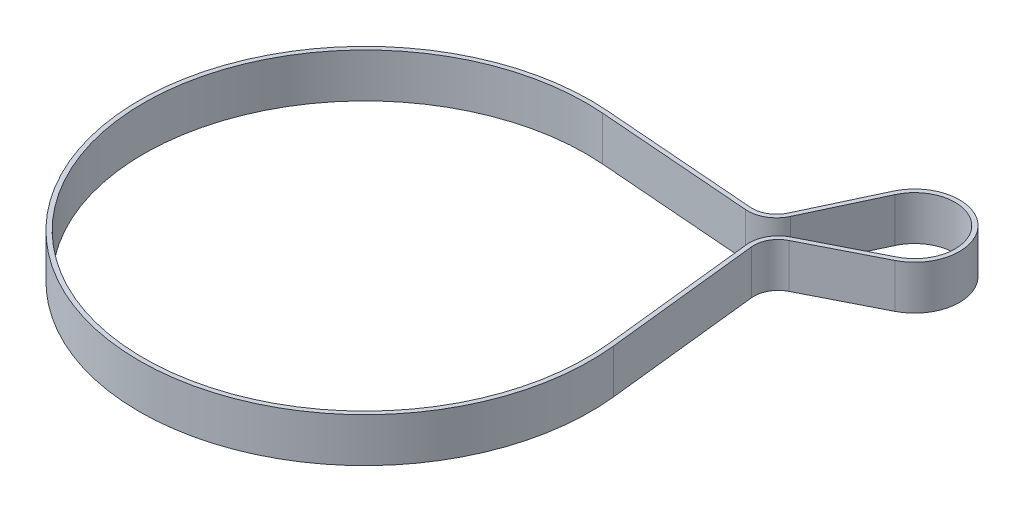
ISO-10303-21;
HEADER;
FILE_DESCRIPTION(('STEP AP214'),'2;1');
FILE_NAME('part.step','',(''),(''),'','','');
FILE_SCHEMA(('AUTOMOTIVE_DESIGN { 1 0 10303 214 1 1 1 1 }'));
ENDSEC;
DATA;
#1=APPLICATION_CONTEXT('core data for automotive mechanical design processes');
#2=APPLICATION_PROTOCOL_DEFINITION('international standard','automotive_design',2000,#1);
#3=PRODUCT_CONTEXT('',#1,'mechanical');
#4=PRODUCT('Part','Part','',(#3));
#5=PRODUCT_RELATED_PRODUCT_CATEGORY('part','',(#4));
#6=PRODUCT_DEFINITION_FORMATION('','',#4);
#7=PRODUCT_DEFINITION_CONTEXT('part definition',#1,'design');
#8=PRODUCT_DEFINITION('design','',#6,#7);
#9=PRODUCT_DEFINITION_SHAPE('','',#8);
#10=(LENGTH_UNIT() NAMED_UNIT(*) SI_UNIT(.MILLI.,.METRE.));
#11=(NAMED_UNIT(*) PLANE_ANGLE_UNIT() SI_UNIT($,.RADIAN.));
#12=(NAMED_UNIT(*) SI_UNIT($,.STERADIAN.) SOLID_ANGLE_UNIT());
#13=UNCERTAINTY_MEASURE_WITH_UNIT(LENGTH_MEASURE(1.E-05),#10,'distance_accuracy_value','');
#14=(GEOMETRIC_REPRESENTATION_CONTEXT(3) GLOBAL_UNCERTAINTY_ASSIGNED_CONTEXT((#13)) GLOBAL_UNIT_ASSIGNED_CONTEXT((#10,
#11,#12)) REPRESENTATION_CONTEXT('',''));
#15=CARTESIAN_POINT('',(0.,0.,0.));
#16=DIRECTION('',(0.,0.,1.));
#17=DIRECTION('',(1.,0.,0.));
#18=AXIS2_PLACEMENT_3D('',#15,#16,#17);
#19=CARTESIAN_POINT('',(6.0102406949203,10.,-56.1325687515136));
#20=DIRECTION('',(0.,-1.,0.));
#21=DIRECTION('',(0.,0.,-1.));
#22=AXIS2_PLACEMENT_3D('',#19,#20,#21);
#23=CYLINDRICAL_SURFACE('',#22,9.16999999999999);
#24=CARTESIAN_POINT('',(6.0102406949203,0.,-56.1325687515136));
#25=DIRECTION('',(0.,1.,0.));
#26=DIRECTION('',(0.,0.,1.));
#27=AXIS2_PLACEMENT_3D('',#24,#25,#26);
#28=CIRCLE('',#27,9.16999999999999);
#29=CARTESIAN_POINT('',(10.1580336639767,0.,-47.9542612563258));
#30=VERTEX_POINT('',#29);
#31=CARTESIAN_POINT('',(-2.29239001303139,0.,-60.0255397669949));
#32=VERTEX_POINT('',#31);
#33=EDGE_CURVE('E262',#30,#32,#28,.T.);
#34=ORIENTED_EDGE('',*,*,#33,.F.);
#35=DIRECTION('',(0.,-1.,0.));
#36=VECTOR('',#35,1.);
#37=CARTESIAN_POINT('',(10.1580336639767,10.,-47.9542612563258));
#38=LINE('',#37,#36);
#39=CARTESIAN_POINT('',(10.1580336639767,10.,-47.9542612563258));
#40=VERTEX_POINT('',#39);
#41=EDGE_CURVE('E11',#40,#30,#38,.T.);
#42=ORIENTED_EDGE('',*,*,#41,.F.);
#43=CARTESIAN_POINT('',(6.0102406949203,10.,-56.1325687515136));
#44=DIRECTION('',(0.,1.,0.));
#45=DIRECTION('',(0.,0.,1.));
#46=AXIS2_PLACEMENT_3D('',#43,#44,#45);
#47=CIRCLE('',#46,9.16999999999999);
#48=CARTESIAN_POINT('',(-2.29239001303139,10.,-60.0255397669949));
#49=VERTEX_POINT('',#48);
#50=EDGE_CURVE('E309',#40,#49,#47,.T.);
#51=ORIENTED_EDGE('',*,*,#50,.T.);
#52=DIRECTION('',(0.,-1.,0.));
#53=VECTOR('',#52,1.);
#54=CARTESIAN_POINT('',(-2.29239001303139,10.,-60.0255397669949));
#55=LINE('',#54,#53);
#56=EDGE_CURVE('E121',#49,#32,#55,.T.);
#57=ORIENTED_EDGE('',*,*,#56,.T.);
#58=EDGE_LOOP('',(#34,#42,#51,#57));
#59=FACE_BOUND('',#58,.T.);
#60=ADVANCED_FACE('F43',(#59),#23,.F.);
#61=CARTESIAN_POINT('',(-17.2667285651984,10.,-34.0452420589981));
#62=DIRECTION('',(-0.452322024978891,0.,-0.891854688679157));
#63=DIRECTION('',(-0.891854688679157,0.,0.452322024978891));
#64=AXIS2_PLACEMENT_3D('',#61,#62,#63);
#65=PLANE('',#64);
#66=DIRECTION('',(0.891854688679157,0.,-0.452322024978891));
#67=VECTOR('',#66,1.);
#68=CARTESIAN_POINT('',(-17.2667285651984,0.,-34.0452420589981));
#69=LINE('',#68,#67);
#70=CARTESIAN_POINT('',(-5.78225911072466,0.,-39.8698214948579));
#71=VERTEX_POINT('',#70);
#72=EDGE_CURVE('E258',#71,#30,#69,.T.);
#73=ORIENTED_EDGE('',*,*,#72,.F.);
#74=DIRECTION('',(0.,-1.,0.));
#75=VECTOR('',#74,1.);
#76=CARTESIAN_POINT('',(-5.78225911072466,10.,-39.8698214948579));
#77=LINE('',#76,#75);
#78=CARTESIAN_POINT('',(-5.78225911072466,10.,-39.8698214948579));
#79=VERTEX_POINT('',#78);
#80=EDGE_CURVE('E54',#79,#71,#77,.T.);
#81=ORIENTED_EDGE('',*,*,#80,.F.);
#82=DIRECTION('',(0.891854688679157,0.,-0.452322024978891));
#83=VECTOR('',#82,1.);
#84=CARTESIAN_POINT('',(-17.2667285651984,10.,-34.0452420589981));
#85=LINE('',#84,#83);
#86=EDGE_CURVE('E305',#79,#40,#85,.T.);
#87=ORIENTED_EDGE('',*,*,#86,.T.);
#88=ORIENTED_EDGE('',*,*,#41,.T.);
#89=EDGE_LOOP('',(#73,#81,#87,#88));
#90=FACE_BOUND('',#89,.T.);
#91=ADVANCED_FACE('F375',(#90),#65,.T.);
#92=CARTESIAN_POINT('',(-2.84216594836187,10.,-34.0727660184434));
#93=DIRECTION('',(0.,-1.,0.));
#94=DIRECTION('',(0.,0.,-1.));
#95=AXIS2_PLACEMENT_3D('',#92,#93,#94);
#96=CYLINDRICAL_SURFACE('',#95,6.5);
#97=CARTESIAN_POINT('',(-2.84216594836187,0.,-34.0727660184434));
#98=DIRECTION('',(0.,1.,0.));
#99=DIRECTION('',(0.,0.,1.));
#100=AXIS2_PLACEMENT_3D('',#97,#98,#99);
#101=CIRCLE('',#100,6.5);
#102=CARTESIAN_POINT('',(-9.30384725859497,0.,-33.3680145409817));
#103=VERTEX_POINT('',#102);
#104=EDGE_CURVE('E254',#71,#103,#101,.T.);
#105=ORIENTED_EDGE('',*,*,#104,.T.);
#106=DIRECTION('',(0.,-1.,0.));
#107=VECTOR('',#106,1.);
#108=CARTESIAN_POINT('',(-9.30384725859497,10.,-33.3680145409817));
#109=LINE('',#108,#107);
#110=CARTESIAN_POINT('',(-9.30384725859497,10.,-33.3680145409817));
#111=VERTEX_POINT('',#110);
#112=EDGE_CURVE('E203',#111,#103,#109,.T.);
#113=ORIENTED_EDGE('',*,*,#112,.F.);
#114=CARTESIAN_POINT('',(-2.84216594836187,10.,-34.0727660184434));
#115=DIRECTION('',(0.,1.,0.));
#116=DIRECTION('',(0.,0.,1.));
#117=AXIS2_PLACEMENT_3D('',#114,#115,#116);
#118=CIRCLE('',#117,6.5);
#119=EDGE_CURVE('E301',#79,#111,#118,.T.);
#120=ORIENTED_EDGE('',*,*,#119,.F.);
#121=ORIENTED_EDGE('',*,*,#80,.T.);
#122=EDGE_LOOP('',(#105,#113,#120,#121));
#123=FACE_BOUND('',#122,.T.);
#124=ADVANCED_FACE('F380',(#123),#96,.T.);
#125=CARTESIAN_POINT('',(-5.59793244797389,10.,0.610545610968511));
#126=DIRECTION('',(0.994104816958937,0.,-0.108423304224868));
#127=DIRECTION('',(-0.108423304224868,0.,-0.994104816958937));
#128=AXIS2_PLACEMENT_3D('',#125,#126,#127);
#129=PLANE('',#128);
#130=DIRECTION('',(0.108423304224868,0.,0.994104816958937));
#131=VECTOR('',#130,1.);
#132=CARTESIAN_POINT('',(-5.59793244797389,0.,0.610545610968511));
#133=LINE('',#132,#131);
#134=CARTESIAN_POINT('',(-5.48086384519525,0.,1.68391690110674));
#135=VERTEX_POINT('',#134);
#136=EDGE_CURVE('E250',#103,#135,#133,.T.);
#137=ORIENTED_EDGE('',*,*,#136,.T.);
#138=DIRECTION('',(0.,-1.,0.));
#139=VECTOR('',#138,1.);
#140=CARTESIAN_POINT('',(-5.48086384519525,10.,1.68391690110674));
#141=LINE('',#140,#139);
#142=CARTESIAN_POINT('',(-5.48086384519525,10.,1.68391690110674));
#143=VERTEX_POINT('',#142);
#144=EDGE_CURVE('E196',#143,#135,#141,.T.);
#145=ORIENTED_EDGE('',*,*,#144,.F.);
#146=DIRECTION('',(0.108423304224868,0.,0.994104816958937));
#147=VECTOR('',#146,1.);
#148=CARTESIAN_POINT('',(-5.59793244797389,10.,0.610545610968511));
#149=LINE('',#148,#147);
#150=EDGE_CURVE('E298',#111,#143,#149,.T.);
#151=ORIENTED_EDGE('',*,*,#150,.F.);
#152=ORIENTED_EDGE('',*,*,#112,.T.);
#153=EDGE_LOOP('',(#137,#145,#151,#152));
#154=FACE_BOUND('',#153,.T.);
#155=ADVANCED_FACE('F405',(#154),#129,.F.);
#156=CARTESIAN_POINT('',(-55.3153383193468,10.,7.11917714189935));
#157=DIRECTION('',(0.,-1.,0.));
#158=DIRECTION('',(0.,0.,-1.));
#159=AXIS2_PLACEMENT_3D('',#156,#157,#158);
#160=CYLINDRICAL_SURFACE('',#159,50.13);
#161=CARTESIAN_POINT('',(-55.3153383193468,0.,7.11917714189935));
#162=DIRECTION('',(0.,1.,0.));
#163=DIRECTION('',(0.,0.,1.));
#164=AXIS2_PLACEMENT_3D('',#161,#162,#163);
#165=CIRCLE('',#164,50.13);
#166=CARTESIAN_POINT('',(-51.4233509763368,0.,-42.8595116616482));
#167=VERTEX_POINT('',#166);
#168=EDGE_CURVE('E246',#167,#135,#165,.T.);
#169=ORIENTED_EDGE('',*,*,#168,.F.);
#170=DIRECTION('',(0.,-1.,0.));
#171=VECTOR('',#170,1.);
#172=CARTESIAN_POINT('',(-51.4233509763368,10.,-42.8595116616482));
#173=LINE('',#172,#171);
#174=CARTESIAN_POINT('',(-51.4233509763368,10.,-42.8595116616482));
#175=VERTEX_POINT('',#174);
#176=EDGE_CURVE('E192',#175,#167,#173,.T.);
#177=ORIENTED_EDGE('',*,*,#176,.F.);
#178=CARTESIAN_POINT('',(-55.3153383193468,10.,7.11917714189935));
#179=DIRECTION('',(0.,1.,0.));
#180=DIRECTION('',(0.,0.,1.));
#181=AXIS2_PLACEMENT_3D('',#178,#179,#180);
#182=CIRCLE('',#181,50.13);
#183=EDGE_CURVE('E184',#175,#143,#182,.T.);
#184=ORIENTED_EDGE('',*,*,#183,.T.);
#185=ORIENTED_EDGE('',*,*,#144,.T.);
#186=EDGE_LOOP('',(#169,#177,#184,#185));
#187=FACE_BOUND('',#186,.T.);
#188=ADVANCED_FACE('F402',(#187),#160,.F.);
#189=CARTESIAN_POINT('',(3.00751673306794,10.,-38.6208200659812));
#190=DIRECTION('',(0.0776378883504883,0.,-0.996981623848944));
#191=DIRECTION('',(-0.996981623848944,0.,-0.0776378883504883));
#192=AXIS2_PLACEMENT_3D('',#189,#190,#191);
#193=PLANE('',#192);
#194=DIRECTION('',(0.996981623848944,0.,0.0776378883504884));
#195=VECTOR('',#194,1.);
#196=CARTESIAN_POINT('',(3.00751673306794,0.,-38.6208200659812));
#197=LINE('',#196,#195);
#198=CARTESIAN_POINT('',(-16.2699839148243,0.,-40.1220156820042));
#199=VERTEX_POINT('',#198);
#200=EDGE_CURVE('E190',#167,#199,#197,.T.);
#201=ORIENTED_EDGE('',*,*,#200,.T.);
#202=DIRECTION('',(0.,-1.,0.));
#203=VECTOR('',#202,1.);
#204=CARTESIAN_POINT('',(-16.2699839148243,10.,-40.1220156820042));
#205=LINE('',#204,#203);
#206=CARTESIAN_POINT('',(-16.2699839148243,10.,-40.1220156820042));
#207=VERTEX_POINT('',#206);
#208=EDGE_CURVE('E174',#207,#199,#205,.T.);
#209=ORIENTED_EDGE('',*,*,#208,.F.);
#210=DIRECTION('',(0.996981623848944,0.,0.0776378883504884));
#211=VECTOR('',#210,1.);
#212=CARTESIAN_POINT('',(3.00751673306794,10.,-38.6208200659812));
#213=LINE('',#212,#211);
#214=EDGE_CURVE('E178',#175,#207,#213,.T.);
#215=ORIENTED_EDGE('',*,*,#214,.F.);
#216=ORIENTED_EDGE('',*,*,#176,.T.);
#217=EDGE_LOOP('',(#201,#209,#215,#216));
#218=FACE_BOUND('',#217,.T.);
#219=ADVANCED_FACE('F188',(#218),#193,.F.);
#220=CARTESIAN_POINT('',(-15.7653376405461,10.,-46.6023962370223));
#221=DIRECTION('',(0.,-1.,0.));
#222=DIRECTION('',(0.,0.,-1.));
#223=AXIS2_PLACEMENT_3D('',#220,#221,#222);
#224=CYLINDRICAL_SURFACE('',#223,6.5);
#225=CARTESIAN_POINT('',(-15.7653376405461,0.,-46.6023962370223));
#226=DIRECTION('',(0.,1.,0.));
#227=DIRECTION('',(0.,0.,1.));
#228=AXIS2_PLACEMENT_3D('',#225,#226,#227);
#229=CIRCLE('',#228,6.5);
#230=CARTESIAN_POINT('',(-9.88015774941352,0.,-43.8429293231043));
#231=VERTEX_POINT('',#230);
#232=EDGE_CURVE('E241',#199,#231,#229,.T.);
#233=ORIENTED_EDGE('',*,*,#232,.T.);
#234=DIRECTION('',(0.,-1.,0.));
#235=VECTOR('',#234,1.);
#236=CARTESIAN_POINT('',(-9.88015774941352,10.,-43.8429293231043));
#237=LINE('',#236,#235);
#238=CARTESIAN_POINT('',(-9.88015774941352,10.,-43.8429293231043));
#239=VERTEX_POINT('',#238);
#240=EDGE_CURVE('E176',#239,#231,#237,.T.);
#241=ORIENTED_EDGE('',*,*,#240,.F.);
#242=CARTESIAN_POINT('',(-15.7653376405461,10.,-46.6023962370223));
#243=DIRECTION('',(0.,1.,0.));
#244=DIRECTION('',(0.,0.,1.));
#245=AXIS2_PLACEMENT_3D('',#242,#243,#244);
#246=CIRCLE('',#245,6.5);
#247=EDGE_CURVE('E169',#207,#239,#246,.T.);
#248=ORIENTED_EDGE('',*,*,#247,.F.);
#249=ORIENTED_EDGE('',*,*,#208,.T.);
#250=EDGE_LOOP('',(#233,#241,#248,#249));
#251=FACE_BOUND('',#250,.T.);
#252=ADVANCED_FACE('F172',(#251),#224,.T.);
#253=CARTESIAN_POINT('',(-16.8144065402195,10.,-33.1533873703189));
#254=DIRECTION('',(-0.452322024978891,0.,-0.891854688679157));
#255=DIRECTION('',(-0.891854688679157,0.,0.452322024978891));
#256=AXIS2_PLACEMENT_3D('',#253,#254,#255);
#257=PLANE('',#256);
#258=DIRECTION('',(0.891854688679157,0.,-0.452322024978891));
#259=VECTOR('',#258,1.);
#260=CARTESIAN_POINT('',(-16.8144065402195,0.,-33.1533873703189));
#261=LINE('',#260,#259);
#262=CARTESIAN_POINT('',(-5.32993708574577,0.,-38.9779668061787));
#263=VERTEX_POINT('',#262);
#264=CARTESIAN_POINT('',(10.6103556889556,0.,-47.0624065676466));
#265=VERTEX_POINT('',#264);
#266=EDGE_CURVE('E291',#263,#265,#261,.T.);
#267=ORIENTED_EDGE('',*,*,#266,.T.);
#268=DIRECTION('',(0.,-1.,0.));
#269=VECTOR('',#268,1.);
#270=CARTESIAN_POINT('',(10.6103556889556,10.,-47.0624065676466));
#271=LINE('',#270,#269);
#272=CARTESIAN_POINT('',(10.6103556889556,10.,-47.0624065676466));
#273=VERTEX_POINT('',#272);
#274=EDGE_CURVE('E47',#273,#265,#271,.T.);
#275=ORIENTED_EDGE('',*,*,#274,.F.);
#276=DIRECTION('',(0.891854688679157,0.,-0.452322024978891));
#277=VECTOR('',#276,1.);
#278=CARTESIAN_POINT('',(-16.8144065402195,10.,-33.1533873703189));
#279=LINE('',#278,#277);
#280=CARTESIAN_POINT('',(-5.32993708574577,10.,-38.9779668061787));
#281=VERTEX_POINT('',#280);
#282=EDGE_CURVE('E240',#281,#273,#279,.T.);
#283=ORIENTED_EDGE('',*,*,#282,.F.);
#284=DIRECTION('',(0.,-1.,0.));
#285=VECTOR('',#284,1.);
#286=CARTESIAN_POINT('',(-5.32993708574577,10.,-38.9779668061787));
#287=LINE('',#286,#285);
#288=EDGE_CURVE('E209',#281,#263,#287,.T.);
#289=ORIENTED_EDGE('',*,*,#288,.T.);
#290=EDGE_LOOP('',(#267,#275,#283,#289));
#291=FACE_BOUND('',#290,.T.);
#292=ADVANCED_FACE('F45',(#291),#257,.F.);
#293=CARTESIAN_POINT('',(6.0102406949203,10.,-56.1325687515136));
#294=DIRECTION('',(0.,-1.,0.));
#295=DIRECTION('',(0.,0.,-1.));
#296=AXIS2_PLACEMENT_3D('',#293,#294,#295);
#297=CYLINDRICAL_SURFACE('',#296,10.17);
#298=CARTESIAN_POINT('',(6.0102406949203,0.,-56.1325687515136));
#299=DIRECTION('',(0.,1.,0.));
#300=DIRECTION('',(0.,0.,1.));
#301=AXIS2_PLACEMENT_3D('',#298,#299,#300);
#302=CIRCLE('',#301,10.17);
#303=CARTESIAN_POINT('',(-3.19780230397487,0.,-60.4500731383669));
#304=VERTEX_POINT('',#303);
#305=EDGE_CURVE('E288',#265,#304,#302,.T.);
#306=ORIENTED_EDGE('',*,*,#305,.T.);
#307=DIRECTION('',(0.,-1.,0.));
#308=VECTOR('',#307,1.);
#309=CARTESIAN_POINT('',(-3.19780230397487,10.,-60.4500731383669));
#310=LINE('',#309,#308);
#311=CARTESIAN_POINT('',(-3.19780230397487,10.,-60.4500731383669));
#312=VERTEX_POINT('',#311);
#313=EDGE_CURVE('E227',#312,#304,#310,.T.);
#314=ORIENTED_EDGE('',*,*,#313,.F.);
#315=CARTESIAN_POINT('',(6.0102406949203,10.,-56.1325687515136));
#316=DIRECTION('',(0.,1.,0.));
#317=DIRECTION('',(0.,0.,1.));
#318=AXIS2_PLACEMENT_3D('',#315,#316,#317);
#319=CIRCLE('',#318,10.17);
#320=EDGE_CURVE('E129',#273,#312,#319,.T.);
#321=ORIENTED_EDGE('',*,*,#320,.F.);
#322=ORIENTED_EDGE('',*,*,#274,.T.);
#323=EDGE_LOOP('',(#306,#314,#321,#322));
#324=FACE_BOUND('',#323,.T.);
#325=ADVANCED_FACE('F471',(#324),#297,.T.);
#326=CARTESIAN_POINT('',(-25.8571289583822,10.,-12.1239950467914));
#327=DIRECTION('',(-0.905412290943478,0.,-0.424533371372008));
#328=DIRECTION('',(-0.424533371372008,0.,0.905412290943478));
#329=AXIS2_PLACEMENT_3D('',#326,#327,#328);
#330=PLANE('',#329);
#331=DIRECTION('',(0.424533371372008,0.,-0.905412290943478));
#332=VECTOR('',#331,1.);
#333=CARTESIAN_POINT('',(-25.8571289583822,0.,-12.1239950467914));
#334=LINE('',#333,#332);
#335=CARTESIAN_POINT('',(-10.785570040357,0.,-44.2674626944763));
#336=VERTEX_POINT('',#335);
#337=EDGE_CURVE('E284',#336,#304,#334,.T.);
#338=ORIENTED_EDGE('',*,*,#337,.F.);
#339=DIRECTION('',(0.,-1.,0.));
#340=VECTOR('',#339,1.);
#341=CARTESIAN_POINT('',(-10.785570040357,10.,-44.2674626944763));
#342=LINE('',#341,#340);
#343=CARTESIAN_POINT('',(-10.785570040357,10.,-44.2674626944763));
#344=VERTEX_POINT('',#343);
#345=EDGE_CURVE('E225',#344,#336,#342,.T.);
#346=ORIENTED_EDGE('',*,*,#345,.F.);
#347=DIRECTION('',(0.424533371372008,0.,-0.905412290943478));
#348=VECTOR('',#347,1.);
#349=CARTESIAN_POINT('',(-25.8571289583822,10.,-12.1239950467914));
#350=LINE('',#349,#348);
#351=EDGE_CURVE('E330',#344,#312,#350,.T.);
#352=ORIENTED_EDGE('',*,*,#351,.T.);
#353=ORIENTED_EDGE('',*,*,#313,.T.);
#354=EDGE_LOOP('',(#338,#346,#352,#353));
#355=FACE_BOUND('',#354,.T.);
#356=ADVANCED_FACE('F364',(#355),#330,.T.);
#357=CARTESIAN_POINT('',(-15.7653376405461,10.,-46.6023962370223));
#358=DIRECTION('',(0.,-1.,0.));
#359=DIRECTION('',(0.,0.,-1.));
#360=AXIS2_PLACEMENT_3D('',#357,#358,#359);
#361=CYLINDRICAL_SURFACE('',#360,5.5);
#362=CARTESIAN_POINT('',(-15.7653376405461,0.,-46.6023962370223));
#363=DIRECTION('',(0.,1.,0.));
#364=DIRECTION('',(0.,0.,1.));
#365=AXIS2_PLACEMENT_3D('',#362,#363,#364);
#366=CIRCLE('',#365,5.5);
#367=CARTESIAN_POINT('',(-16.1923460264738,0.,-41.1189973058531));
#368=VERTEX_POINT('',#367);
#369=EDGE_CURVE('E280',#368,#336,#366,.T.);
#370=ORIENTED_EDGE('',*,*,#369,.F.);
#371=DIRECTION('',(0.,-1.,0.));
#372=VECTOR('',#371,1.);
#373=CARTESIAN_POINT('',(-16.1923460264738,10.,-41.1189973058531));
#374=LINE('',#373,#372);
#375=CARTESIAN_POINT('',(-16.1923460264738,10.,-41.1189973058531));
#376=VERTEX_POINT('',#375);
#377=EDGE_CURVE('E222',#376,#368,#374,.T.);
#378=ORIENTED_EDGE('',*,*,#377,.F.);
#379=CARTESIAN_POINT('',(-15.7653376405461,10.,-46.6023962370223));
#380=DIRECTION('',(0.,1.,0.));
#381=DIRECTION('',(0.,0.,1.));
#382=AXIS2_PLACEMENT_3D('',#379,#380,#381);
#383=CIRCLE('',#382,5.5);
#384=EDGE_CURVE('E326',#376,#344,#383,.T.);
#385=ORIENTED_EDGE('',*,*,#384,.T.);
#386=ORIENTED_EDGE('',*,*,#345,.T.);
#387=EDGE_LOOP('',(#370,#378,#385,#386));
#388=FACE_BOUND('',#387,.T.);
#389=ADVANCED_FACE('F363',(#388),#361,.F.);
#390=CARTESIAN_POINT('',(3.08515462141843,10.,-39.6178016898302));
#391=DIRECTION('',(0.0776378883504883,0.,-0.996981623848944));
#392=DIRECTION('',(-0.996981623848944,0.,-0.0776378883504883));
#393=AXIS2_PLACEMENT_3D('',#390,#391,#392);
#394=PLANE('',#393);
#395=DIRECTION('',(0.996981623848944,0.,0.0776378883504884));
#396=VECTOR('',#395,1.);
#397=CARTESIAN_POINT('',(3.08515462141843,0.,-39.6178016898302));
#398=LINE('',#397,#396);
#399=CARTESIAN_POINT('',(-51.3457130879863,0.,-43.8564932854972));
#400=VERTEX_POINT('',#399);
#401=EDGE_CURVE('E276',#400,#368,#398,.T.);
#402=ORIENTED_EDGE('',*,*,#401,.F.);
#403=DIRECTION('',(0.,-1.,0.));
#404=VECTOR('',#403,1.);
#405=CARTESIAN_POINT('',(-51.3457130879863,10.,-43.8564932854972));
#406=LINE('',#405,#404);
#407=CARTESIAN_POINT('',(-51.3457130879863,10.,-43.8564932854972));
#408=VERTEX_POINT('',#407);
#409=EDGE_CURVE('E219',#408,#400,#406,.T.);
#410=ORIENTED_EDGE('',*,*,#409,.F.);
#411=DIRECTION('',(0.996981623848944,0.,0.0776378883504884));
#412=VECTOR('',#411,1.);
#413=CARTESIAN_POINT('',(3.08515462141843,10.,-39.6178016898302));
#414=LINE('',#413,#412);
#415=EDGE_CURVE('E322',#408,#376,#414,.T.);
#416=ORIENTED_EDGE('',*,*,#415,.T.);
#417=ORIENTED_EDGE('',*,*,#377,.T.);
#418=EDGE_LOOP('',(#402,#410,#416,#417));
#419=FACE_BOUND('',#418,.T.);
#420=ADVANCED_FACE('F357',(#419),#394,.T.);
#421=CARTESIAN_POINT('',(-55.3153383193468,10.,7.11917714189935));
#422=DIRECTION('',(0.,-1.,0.));
#423=DIRECTION('',(0.,0.,-1.));
#424=AXIS2_PLACEMENT_3D('',#421,#422,#423);
#425=CYLINDRICAL_SURFACE('',#424,51.13);
#426=CARTESIAN_POINT('',(-55.3153383193468,0.,7.11917714189935));
#427=DIRECTION('',(0.,1.,0.));
#428=DIRECTION('',(0.,0.,1.));
#429=AXIS2_PLACEMENT_3D('',#426,#427,#428);
#430=CIRCLE('',#429,51.13);
#431=CARTESIAN_POINT('',(-4.48675902823632,0.,1.57549359688186));
#432=VERTEX_POINT('',#431);
#433=EDGE_CURVE('E273',#400,#432,#430,.T.);
#434=ORIENTED_EDGE('',*,*,#433,.T.);
#435=DIRECTION('',(0.,-1.,0.));
#436=VECTOR('',#435,1.);
#437=CARTESIAN_POINT('',(-4.48675902823632,10.,1.57549359688186));
#438=LINE('',#437,#436);
#439=CARTESIAN_POINT('',(-4.48675902823632,10.,1.57549359688186));
#440=VERTEX_POINT('',#439);
#441=EDGE_CURVE('E215',#440,#432,#438,.T.);
#442=ORIENTED_EDGE('',*,*,#441,.F.);
#443=CARTESIAN_POINT('',(-55.3153383193468,10.,7.11917714189935));
#444=DIRECTION('',(0.,1.,0.));
#445=DIRECTION('',(0.,0.,1.));
#446=AXIS2_PLACEMENT_3D('',#443,#444,#445);
#447=CIRCLE('',#446,51.13);
#448=EDGE_CURVE('E319',#408,#440,#447,.T.);
#449=ORIENTED_EDGE('',*,*,#448,.F.);
#450=ORIENTED_EDGE('',*,*,#409,.T.);
#451=EDGE_LOOP('',(#434,#442,#449,#450));
#452=FACE_BOUND('',#451,.T.);
#453=ADVANCED_FACE('F365',(#452),#425,.T.);
#454=CARTESIAN_POINT('',(-4.60382763101496,10.,0.502122306743644));
#455=DIRECTION('',(-0.994104816958937,0.,0.108423304224868));
#456=DIRECTION('',(0.108423304224868,0.,0.994104816958937));
#457=AXIS2_PLACEMENT_3D('',#454,#455,#456);
#458=PLANE('',#457);
#459=DIRECTION('',(-0.108423304224868,0.,-0.994104816958937));
#460=VECTOR('',#459,1.);
#461=CARTESIAN_POINT('',(-4.60382763101496,0.,0.502122306743644));
#462=LINE('',#461,#460);
#463=CARTESIAN_POINT('',(-8.30974244163604,0.,-33.4764378452066));
#464=VERTEX_POINT('',#463);
#465=EDGE_CURVE('E269',#432,#464,#462,.T.);
#466=ORIENTED_EDGE('',*,*,#465,.T.);
#467=DIRECTION('',(0.,-1.,0.));
#468=VECTOR('',#467,1.);
#469=CARTESIAN_POINT('',(-8.30974244163604,10.,-33.4764378452066));
#470=LINE('',#469,#468);
#471=CARTESIAN_POINT('',(-8.30974244163604,10.,-33.4764378452066));
#472=VERTEX_POINT('',#471);
#473=EDGE_CURVE('E212',#472,#464,#470,.T.);
#474=ORIENTED_EDGE('',*,*,#473,.F.);
#475=DIRECTION('',(-0.108423304224868,0.,-0.994104816958937));
#476=VECTOR('',#475,1.);
#477=CARTESIAN_POINT('',(-4.60382763101496,10.,0.502122306743644));
#478=LINE('',#477,#476);
#479=EDGE_CURVE('E316',#440,#472,#478,.T.);
#480=ORIENTED_EDGE('',*,*,#479,.F.);
#481=ORIENTED_EDGE('',*,*,#441,.T.);
#482=EDGE_LOOP('',(#466,#474,#480,#481));
#483=FACE_BOUND('',#482,.T.);
#484=ADVANCED_FACE('F351',(#483),#458,.F.);
#485=CARTESIAN_POINT('',(-2.84216594836187,10.,-34.0727660184434));
#486=DIRECTION('',(0.,-1.,0.));
#487=DIRECTION('',(0.,0.,-1.));
#488=AXIS2_PLACEMENT_3D('',#485,#486,#487);
#489=CYLINDRICAL_SURFACE('',#488,5.5);
#490=CARTESIAN_POINT('',(-2.84216594836187,0.,-34.0727660184434));
#491=DIRECTION('',(0.,1.,0.));
#492=DIRECTION('',(0.,0.,1.));
#493=AXIS2_PLACEMENT_3D('',#490,#491,#492);
#494=CIRCLE('',#493,5.5);
#495=EDGE_CURVE('E265',#263,#464,#494,.T.);
#496=ORIENTED_EDGE('',*,*,#495,.F.);
#497=ORIENTED_EDGE('',*,*,#288,.F.);
#498=CARTESIAN_POINT('',(-2.84216594836187,10.,-34.0727660184434));
#499=DIRECTION('',(0.,1.,0.));
#500=DIRECTION('',(0.,0.,1.));
#501=AXIS2_PLACEMENT_3D('',#498,#499,#500);
#502=CIRCLE('',#501,5.5);
#503=EDGE_CURVE('E312',#281,#472,#502,.T.);
#504=ORIENTED_EDGE('',*,*,#503,.T.);
#505=ORIENTED_EDGE('',*,*,#473,.T.);
#506=EDGE_LOOP('',(#496,#497,#504,#505));
#507=FACE_BOUND('',#506,.T.);
#508=ADVANCED_FACE('F347',(#507),#489,.F.);
#509=CARTESIAN_POINT('',(-24.9517166674386,10.,-11.6994616754193));
#510=DIRECTION('',(-0.905412290943478,0.,-0.424533371372007));
#511=DIRECTION('',(-0.424533371372007,0.,0.905412290943478));
#512=AXIS2_PLACEMENT_3D('',#509,#510,#511);
#513=PLANE('',#512);
#514=DIRECTION('',(0.424533371372007,0.,-0.905412290943478));
#515=VECTOR('',#514,1.);
#516=CARTESIAN_POINT('',(-24.9517166674386,0.,-11.6994616754193));
#517=LINE('',#516,#515);
#518=EDGE_CURVE('E114',#231,#32,#517,.T.);
#519=ORIENTED_EDGE('',*,*,#518,.T.);
#520=ORIENTED_EDGE('',*,*,#56,.F.);
#521=DIRECTION('',(0.424533371372007,0.,-0.905412290943478));
#522=VECTOR('',#521,1.);
#523=CARTESIAN_POINT('',(-24.9517166674386,10.,-11.6994616754193));
#524=LINE('',#523,#522);
#525=EDGE_CURVE('E63',#239,#49,#524,.T.);
#526=ORIENTED_EDGE('',*,*,#525,.F.);
#527=ORIENTED_EDGE('',*,*,#240,.T.);
#528=EDGE_LOOP('',(#519,#520,#526,#527));
#529=FACE_BOUND('',#528,.T.);
#530=ADVANCED_FACE('F386',(#529),#513,.F.);
#531=CARTESIAN_POINT('',(0.,10.,0.));
#532=DIRECTION('',(0.,1.,0.));
#533=DIRECTION('',(0.,0.,1.));
#534=AXIS2_PLACEMENT_3D('',#531,#532,#533);
#535=PLANE('',#534);
#536=ORIENTED_EDGE('',*,*,#282,.T.);
#537=ORIENTED_EDGE('',*,*,#320,.T.);
#538=ORIENTED_EDGE('',*,*,#351,.F.);
#539=ORIENTED_EDGE('',*,*,#384,.F.);
#540=ORIENTED_EDGE('',*,*,#415,.F.);
#541=ORIENTED_EDGE('',*,*,#448,.T.);
#542=ORIENTED_EDGE('',*,*,#479,.T.);
#543=ORIENTED_EDGE('',*,*,#503,.F.);
#544=EDGE_LOOP('',(#536,#537,#538,#539,#540,#541,#542,#543));
#545=FACE_BOUND('',#544,.T.);
#546=ORIENTED_EDGE('',*,*,#50,.F.);
#547=ORIENTED_EDGE('',*,*,#86,.F.);
#548=ORIENTED_EDGE('',*,*,#119,.T.);
#549=ORIENTED_EDGE('',*,*,#150,.T.);
#550=ORIENTED_EDGE('',*,*,#183,.F.);
#551=ORIENTED_EDGE('',*,*,#214,.T.);
#552=ORIENTED_EDGE('',*,*,#247,.T.);
#553=ORIENTED_EDGE('',*,*,#525,.T.);
#554=EDGE_LOOP('',(#546,#547,#548,#549,#550,#551,#552,#553));
#555=FACE_BOUND('',#554,.T.);
#556=ADVANCED_FACE('F182',(#545,#555),#535,.T.);
#557=CARTESIAN_POINT('',(0.,0.,0.));
#558=DIRECTION('',(0.,1.,0.));
#559=DIRECTION('',(0.,0.,1.));
#560=AXIS2_PLACEMENT_3D('',#557,#558,#559);
#561=PLANE('',#560);
#562=ORIENTED_EDGE('',*,*,#266,.F.);
#563=ORIENTED_EDGE('',*,*,#495,.T.);
#564=ORIENTED_EDGE('',*,*,#465,.F.);
#565=ORIENTED_EDGE('',*,*,#433,.F.);
#566=ORIENTED_EDGE('',*,*,#401,.T.);
#567=ORIENTED_EDGE('',*,*,#369,.T.);
#568=ORIENTED_EDGE('',*,*,#337,.T.);
#569=ORIENTED_EDGE('',*,*,#305,.F.);
#570=EDGE_LOOP('',(#562,#563,#564,#565,#566,#567,#568,#569));
#571=FACE_BOUND('',#570,.T.);
#572=ORIENTED_EDGE('',*,*,#33,.T.);
#573=ORIENTED_EDGE('',*,*,#518,.F.);
#574=ORIENTED_EDGE('',*,*,#232,.F.);
#575=ORIENTED_EDGE('',*,*,#200,.F.);
#576=ORIENTED_EDGE('',*,*,#168,.T.);
#577=ORIENTED_EDGE('',*,*,#136,.F.);
#578=ORIENTED_EDGE('',*,*,#104,.F.);
#579=ORIENTED_EDGE('',*,*,#72,.T.);
#580=EDGE_LOOP('',(#572,#573,#574,#575,#576,#577,#578,#579));
#581=FACE_BOUND('',#580,.T.);
#582=ADVANCED_FACE('F344',(#571,#581),#561,.F.);
#583=CLOSED_SHELL('',(#60,#91,#124,#155,#188,#219,#252,#292,#325,#356,#389,#420,#453,#484,#508,
#530,#556,#582));
#584=MANIFOLD_SOLID_BREP('B2',#583);
#585=ADVANCED_BREP_SHAPE_REPRESENTATION('',(#18,#584),#14);
#586=SHAPE_DEFINITION_REPRESENTATION(#9,#585);
ENDSEC;
END-ISO-10303-21;
